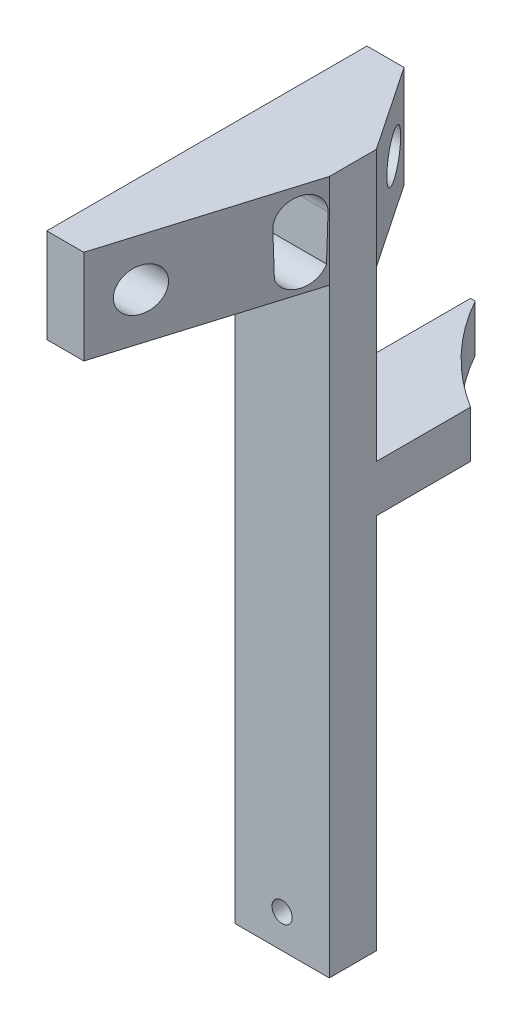
ISO-10303-21;
HEADER;
FILE_DESCRIPTION(('STEP AP214'),'2;1');
FILE_NAME('part.step','',(''),(''),'','','');
FILE_SCHEMA(('AUTOMOTIVE_DESIGN { 1 0 10303 214 1 1 1 1 }'));
ENDSEC;
DATA;
#1=APPLICATION_CONTEXT('core data for automotive mechanical design processes');
#2=APPLICATION_PROTOCOL_DEFINITION('international standard','automotive_design',2000,#1);
#3=PRODUCT_CONTEXT('',#1,'mechanical');
#4=PRODUCT('Part','Part','',(#3));
#5=PRODUCT_RELATED_PRODUCT_CATEGORY('part','',(#4));
#6=PRODUCT_DEFINITION_FORMATION('','',#4);
#7=PRODUCT_DEFINITION_CONTEXT('part definition',#1,'design');
#8=PRODUCT_DEFINITION('design','',#6,#7);
#9=PRODUCT_DEFINITION_SHAPE('','',#8);
#10=(LENGTH_UNIT() NAMED_UNIT(*) SI_UNIT(.MILLI.,.METRE.));
#11=(NAMED_UNIT(*) PLANE_ANGLE_UNIT() SI_UNIT($,.RADIAN.));
#12=(NAMED_UNIT(*) SI_UNIT($,.STERADIAN.) SOLID_ANGLE_UNIT());
#13=UNCERTAINTY_MEASURE_WITH_UNIT(LENGTH_MEASURE(1.E-05),#10,'distance_accuracy_value','');
#14=(GEOMETRIC_REPRESENTATION_CONTEXT(3) GLOBAL_UNCERTAINTY_ASSIGNED_CONTEXT((#13)) GLOBAL_UNIT_ASSIGNED_CONTEXT((#10,
#11,#12)) REPRESENTATION_CONTEXT('',''));
#15=CARTESIAN_POINT('',(0.,0.,0.));
#16=DIRECTION('',(0.,0.,1.));
#17=DIRECTION('',(1.,0.,0.));
#18=AXIS2_PLACEMENT_3D('',#15,#16,#17);
#19=CARTESIAN_POINT('',(0.,0.,0.));
#20=DIRECTION('',(0.,0.,1.));
#21=DIRECTION('',(1.,0.,0.));
#22=AXIS2_PLACEMENT_3D('',#19,#20,#21);
#23=PLANE('',#22);
#24=CARTESIAN_POINT('',(20.,-124.653388527127,0.));
#25=DIRECTION('',(0.,0.,1.));
#26=DIRECTION('',(1.,0.,0.));
#27=AXIS2_PLACEMENT_3D('',#24,#25,#26);
#28=CIRCLE('',#27,2.15);
#29=CARTESIAN_POINT('',(22.15,-124.653388527127,0.));
#30=VERTEX_POINT('',#29);
#31=EDGE_CURVE('E285',#30,#30,#28,.T.);
#32=ORIENTED_EDGE('',*,*,#31,.T.);
#33=EDGE_LOOP('',(#32));
#34=FACE_BOUND('',#33,.T.);
#35=DIRECTION('',(-1.,0.,0.));
#36=VECTOR('',#35,1.);
#37=CARTESIAN_POINT('',(30.0137626059961,-51.8033885271269,0.));
#38=LINE('',#37,#36);
#39=CARTESIAN_POINT('',(30.0137626059961,-51.8033885271269,0.));
#40=VERTEX_POINT('',#39);
#41=CARTESIAN_POINT('',(10.0137626059961,-51.8033885271269,0.));
#42=VERTEX_POINT('',#41);
#43=EDGE_CURVE('E379',#40,#42,#38,.T.);
#44=ORIENTED_EDGE('',*,*,#43,.F.);
#45=DIRECTION('',(0.,1.,0.));
#46=VECTOR('',#45,1.);
#47=CARTESIAN_POINT('',(30.0137626059961,15.6116114728731,0.));
#48=LINE('',#47,#46);
#49=CARTESIAN_POINT('',(30.0137626059961,-131.803388527127,0.));
#50=VERTEX_POINT('',#49);
#51=EDGE_CURVE('E184',#50,#40,#48,.T.);
#52=ORIENTED_EDGE('',*,*,#51,.F.);
#53=DIRECTION('',(1.,0.,0.));
#54=VECTOR('',#53,1.);
#55=CARTESIAN_POINT('',(10.0137626059961,-131.803388527127,0.));
#56=LINE('',#55,#54);
#57=CARTESIAN_POINT('',(10.0137626059961,-131.803388527127,0.));
#58=VERTEX_POINT('',#57);
#59=EDGE_CURVE('E302',#58,#50,#56,.T.);
#60=ORIENTED_EDGE('',*,*,#59,.F.);
#61=DIRECTION('',(0.,-1.,0.));
#62=VECTOR('',#61,1.);
#63=CARTESIAN_POINT('',(10.0137626059961,15.6116114728731,0.));
#64=LINE('',#63,#62);
#65=EDGE_CURVE('E289',#42,#58,#64,.T.);
#66=ORIENTED_EDGE('',*,*,#65,.F.);
#67=EDGE_LOOP('',(#44,#52,#60,#66));
#68=FACE_BOUND('',#67,.T.);
#69=ADVANCED_FACE('F39',(#34,#68),#23,.F.);
#70=DIRECTION('',(1.,0.,0.));
#71=VECTOR('',#70,1.);
#72=CARTESIAN_POINT('',(30.0137626059961,-41.8033885271269,0.));
#73=LINE('',#72,#71);
#74=CARTESIAN_POINT('',(10.0137626059961,-41.8033885271269,0.));
#75=VERTEX_POINT('',#74);
#76=CARTESIAN_POINT('',(30.0137626059961,-41.8033885271269,0.));
#77=VERTEX_POINT('',#76);
#78=EDGE_CURVE('E365',#75,#77,#73,.T.);
#79=ORIENTED_EDGE('',*,*,#78,.F.);
#80=CARTESIAN_POINT('',(10.0137626059961,-6.02423430513092,0.));
#81=VERTEX_POINT('',#80);
#82=EDGE_CURVE('E299',#81,#75,#64,.T.);
#83=ORIENTED_EDGE('',*,*,#82,.F.);
#84=DIRECTION('',(-1.,0.,0.));
#85=VECTOR('',#84,1.);
#86=CARTESIAN_POINT('',(30.0137626059961,-6.02423430513092,0.));
#87=LINE('',#86,#85);
#88=CARTESIAN_POINT('',(30.0137626059961,-6.02423430513092,0.));
#89=VERTEX_POINT('',#88);
#90=EDGE_CURVE('E257',#89,#81,#87,.T.);
#91=ORIENTED_EDGE('',*,*,#90,.F.);
#92=EDGE_CURVE('E304',#77,#89,#48,.T.);
#93=ORIENTED_EDGE('',*,*,#92,.F.);
#94=EDGE_LOOP('',(#79,#83,#91,#93));
#95=FACE_BOUND('',#94,.T.);
#96=ADVANCED_FACE('F364',(#95),#23,.F.);
#97=CARTESIAN_POINT('',(30.0137626059961,15.6116114728731,10.));
#98=DIRECTION('',(-1.,0.,0.));
#99=DIRECTION('',(0.,-1.,0.));
#100=AXIS2_PLACEMENT_3D('',#97,#98,#99);
#101=PLANE('',#100);
#102=DIRECTION('',(0.,0.,1.));
#103=VECTOR('',#102,1.);
#104=CARTESIAN_POINT('',(30.0137626059961,-51.8033885271269,-40.));
#105=LINE('',#104,#103);
#106=CARTESIAN_POINT('',(30.0137626059961,-51.8033885271269,-20.));
#107=VERTEX_POINT('',#106);
#108=EDGE_CURVE('E176',#107,#40,#105,.T.);
#109=ORIENTED_EDGE('',*,*,#108,.F.);
#110=DIRECTION('',(0.,1.,0.));
#111=VECTOR('',#110,1.);
#112=CARTESIAN_POINT('',(30.0137626059961,-131.804388527127,-20.));
#113=LINE('',#112,#111);
#114=CARTESIAN_POINT('',(30.0137626059961,-41.8033885271269,-20.));
#115=VERTEX_POINT('',#114);
#116=EDGE_CURVE('E164',#107,#115,#113,.T.);
#117=ORIENTED_EDGE('',*,*,#116,.T.);
#118=DIRECTION('',(0.,0.,1.));
#119=VECTOR('',#118,1.);
#120=CARTESIAN_POINT('',(30.0137626059961,-41.8033885271269,-40.));
#121=LINE('',#120,#119);
#122=EDGE_CURVE('E360',#115,#77,#121,.T.);
#123=ORIENTED_EDGE('',*,*,#122,.T.);
#124=ORIENTED_EDGE('',*,*,#92,.T.);
#125=DIRECTION('',(0.,1.,0.));
#126=VECTOR('',#125,1.);
#127=CARTESIAN_POINT('',(30.0137626059961,-14.3883885271269,0.));
#128=LINE('',#127,#126);
#129=CARTESIAN_POINT('',(30.0137626059961,15.6116114728731,0.));
#130=VERTEX_POINT('',#129);
#131=EDGE_CURVE('E241',#89,#130,#128,.T.);
#132=ORIENTED_EDGE('',*,*,#131,.T.);
#133=DIRECTION('',(0.,0.,-1.));
#134=VECTOR('',#133,1.);
#135=CARTESIAN_POINT('',(30.0137626059961,15.6116114728731,10.));
#136=LINE('',#135,#134);
#137=CARTESIAN_POINT('',(30.0137626059961,15.6116114728731,10.));
#138=VERTEX_POINT('',#137);
#139=EDGE_CURVE('E307',#138,#130,#136,.T.);
#140=ORIENTED_EDGE('',*,*,#139,.F.);
#141=DIRECTION('',(0.,1.,0.));
#142=VECTOR('',#141,1.);
#143=CARTESIAN_POINT('',(30.0137626059961,-14.3883885271269,10.));
#144=LINE('',#143,#142);
#145=CARTESIAN_POINT('',(30.0137626059961,-4.38838852712687,10.));
#146=VERTEX_POINT('',#145);
#147=EDGE_CURVE('E245',#146,#138,#144,.T.);
#148=ORIENTED_EDGE('',*,*,#147,.F.);
#149=DIRECTION('',(0.,1.,0.));
#150=VECTOR('',#149,1.);
#151=CARTESIAN_POINT('',(30.0137626059961,15.6116114728731,10.));
#152=LINE('',#151,#150);
#153=CARTESIAN_POINT('',(30.0137626059961,-131.803388527127,10.));
#154=VERTEX_POINT('',#153);
#155=EDGE_CURVE('E296',#154,#146,#152,.T.);
#156=ORIENTED_EDGE('',*,*,#155,.F.);
#157=DIRECTION('',(0.,0.,-1.));
#158=VECTOR('',#157,1.);
#159=CARTESIAN_POINT('',(30.0137626059961,-131.803388527127,10.));
#160=LINE('',#159,#158);
#161=EDGE_CURVE('E310',#154,#50,#160,.T.);
#162=ORIENTED_EDGE('',*,*,#161,.T.);
#163=ORIENTED_EDGE('',*,*,#51,.T.);
#164=EDGE_LOOP('',(#109,#117,#123,#124,#132,#140,#148,#156,#162,#163));
#165=FACE_BOUND('',#164,.T.);
#166=ADVANCED_FACE('F181',(#165),#101,.F.);
#167=CARTESIAN_POINT('',(10.0137626059961,15.6116114728731,10.));
#168=DIRECTION('',(0.,-1.,0.));
#169=DIRECTION('',(0.,0.,-1.));
#170=AXIS2_PLACEMENT_3D('',#167,#168,#169);
#171=PLANE('',#170);
#172=DIRECTION('',(0.289980833294845,0.,-0.957032453118298));
#173=VECTOR('',#172,1.);
#174=CARTESIAN_POINT('',(30.0137626059961,15.6116114728731,10.));
#175=LINE('',#174,#173);
#176=CARTESIAN_POINT('',(17.8937626059961,15.6116114728731,50.));
#177=VERTEX_POINT('',#176);
#178=EDGE_CURVE('E242',#177,#138,#175,.T.);
#179=ORIENTED_EDGE('',*,*,#178,.T.);
#180=ORIENTED_EDGE('',*,*,#139,.T.);
#181=DIRECTION('',(-0.558522736207715,0.,-0.829489212189675));
#182=VECTOR('',#181,1.);
#183=CARTESIAN_POINT('',(30.0137626059961,15.6116114728731,0.));
#184=LINE('',#183,#182);
#185=CARTESIAN_POINT('',(17.8937626059961,15.6116114728731,-18.));
#186=VERTEX_POINT('',#185);
#187=EDGE_CURVE('E246',#130,#186,#184,.T.);
#188=ORIENTED_EDGE('',*,*,#187,.T.);
#189=DIRECTION('',(1.,0.,0.));
#190=VECTOR('',#189,1.);
#191=CARTESIAN_POINT('',(30.0137626059961,15.6116114728731,-18.));
#192=LINE('',#191,#190);
#193=CARTESIAN_POINT('',(10.0137626059961,15.6116114728731,-18.));
#194=VERTEX_POINT('',#193);
#195=EDGE_CURVE('E263',#194,#186,#192,.T.);
#196=ORIENTED_EDGE('',*,*,#195,.F.);
#197=DIRECTION('',(0.,0.,-1.));
#198=VECTOR('',#197,1.);
#199=CARTESIAN_POINT('',(10.0137626059961,15.6116114728731,10.));
#200=LINE('',#199,#198);
#201=CARTESIAN_POINT('',(10.0137626059961,15.6116114728731,50.));
#202=VERTEX_POINT('',#201);
#203=EDGE_CURVE('E298',#202,#194,#200,.T.);
#204=ORIENTED_EDGE('',*,*,#203,.F.);
#205=DIRECTION('',(-1.,0.,0.));
#206=VECTOR('',#205,1.);
#207=CARTESIAN_POINT('',(10.0137626059961,15.6116114728731,50.));
#208=LINE('',#207,#206);
#209=EDGE_CURVE('E278',#177,#202,#208,.T.);
#210=ORIENTED_EDGE('',*,*,#209,.F.);
#211=EDGE_LOOP('',(#179,#180,#188,#196,#204,#210));
#212=FACE_BOUND('',#211,.T.);
#213=ADVANCED_FACE('F355',(#212),#171,.F.);
#214=CARTESIAN_POINT('',(10.0137626059961,-4.38838852712687,50.));
#215=DIRECTION('',(0.,1.,0.));
#216=DIRECTION('',(0.,0.,1.));
#217=AXIS2_PLACEMENT_3D('',#214,#215,#216);
#218=PLANE('',#217);
#219=DIRECTION('',(0.289980833294845,0.,-0.957032453118298));
#220=VECTOR('',#219,1.);
#221=CARTESIAN_POINT('',(17.2311422026105,-4.38838852712687,52.1868660177742));
#222=LINE('',#221,#220);
#223=CARTESIAN_POINT('',(17.8937626059961,-4.38838852712687,50.));
#224=VERTEX_POINT('',#223);
#225=EDGE_CURVE('E254',#224,#146,#222,.T.);
#226=ORIENTED_EDGE('',*,*,#225,.F.);
#227=DIRECTION('',(1.,0.,0.));
#228=VECTOR('',#227,1.);
#229=CARTESIAN_POINT('',(10.0137626059961,-4.38838852712687,50.));
#230=LINE('',#229,#228);
#231=CARTESIAN_POINT('',(10.0137626059961,-4.38838852712687,50.));
#232=VERTEX_POINT('',#231);
#233=EDGE_CURVE('E275',#232,#224,#230,.T.);
#234=ORIENTED_EDGE('',*,*,#233,.F.);
#235=DIRECTION('',(0.,0.,-1.));
#236=VECTOR('',#235,1.);
#237=CARTESIAN_POINT('',(10.0137626059961,-4.38838852712687,50.));
#238=LINE('',#237,#236);
#239=CARTESIAN_POINT('',(10.0137626059961,-4.38838852712687,10.));
#240=VERTEX_POINT('',#239);
#241=EDGE_CURVE('E280',#232,#240,#238,.T.);
#242=ORIENTED_EDGE('',*,*,#241,.T.);
#243=DIRECTION('',(1.,0.,0.));
#244=VECTOR('',#243,1.);
#245=CARTESIAN_POINT('',(10.0137626059961,-4.38838852712687,10.));
#246=LINE('',#245,#244);
#247=EDGE_CURVE('E271',#240,#146,#246,.T.);
#248=ORIENTED_EDGE('',*,*,#247,.T.);
#249=EDGE_LOOP('',(#226,#234,#242,#248));
#250=FACE_BOUND('',#249,.T.);
#251=ADVANCED_FACE('F406',(#250),#218,.F.);
#252=CARTESIAN_POINT('',(0.,0.,50.));
#253=DIRECTION('',(0.,0.,1.));
#254=DIRECTION('',(1.,0.,0.));
#255=AXIS2_PLACEMENT_3D('',#252,#253,#254);
#256=PLANE('',#255);
#257=ORIENTED_EDGE('',*,*,#233,.T.);
#258=DIRECTION('',(0.,1.,0.));
#259=VECTOR('',#258,1.);
#260=CARTESIAN_POINT('',(17.8937626059961,0.,50.));
#261=LINE('',#260,#259);
#262=EDGE_CURVE('E318',#224,#177,#261,.T.);
#263=ORIENTED_EDGE('',*,*,#262,.T.);
#264=ORIENTED_EDGE('',*,*,#209,.T.);
#265=DIRECTION('',(0.,-1.,0.));
#266=VECTOR('',#265,1.);
#267=CARTESIAN_POINT('',(10.0137626059961,15.6116114728731,50.));
#268=LINE('',#267,#266);
#269=EDGE_CURVE('E272',#202,#232,#268,.T.);
#270=ORIENTED_EDGE('',*,*,#269,.T.);
#271=EDGE_LOOP('',(#257,#263,#264,#270));
#272=FACE_BOUND('',#271,.T.);
#273=ADVANCED_FACE('F429',(#272),#256,.T.);
#274=CARTESIAN_POINT('',(30.0137626059961,-6.02423430513092,-18.));
#275=DIRECTION('',(0.,1.,0.));
#276=DIRECTION('',(0.,0.,1.));
#277=AXIS2_PLACEMENT_3D('',#274,#275,#276);
#278=PLANE('',#277);
#279=DIRECTION('',(-0.558522736207715,0.,-0.829489212189675));
#280=VECTOR('',#279,1.);
#281=CARTESIAN_POINT('',(21.6745680859508,-6.02423430513092,-12.3849423565028));
#282=LINE('',#281,#280);
#283=CARTESIAN_POINT('',(17.893762605996,-6.02423430513092,-18.));
#284=VERTEX_POINT('',#283);
#285=EDGE_CURVE('E248',#89,#284,#282,.T.);
#286=ORIENTED_EDGE('',*,*,#285,.F.);
#287=ORIENTED_EDGE('',*,*,#90,.T.);
#288=DIRECTION('',(0.,0.,1.));
#289=VECTOR('',#288,1.);
#290=CARTESIAN_POINT('',(10.0137626059961,-6.02423430513092,-18.));
#291=LINE('',#290,#289);
#292=CARTESIAN_POINT('',(10.0137626059961,-6.02423430513092,-18.));
#293=VERTEX_POINT('',#292);
#294=EDGE_CURVE('E266',#293,#81,#291,.T.);
#295=ORIENTED_EDGE('',*,*,#294,.F.);
#296=DIRECTION('',(-1.,0.,0.));
#297=VECTOR('',#296,1.);
#298=CARTESIAN_POINT('',(30.0137626059961,-6.02423430513092,-18.));
#299=LINE('',#298,#297);
#300=EDGE_CURVE('E258',#284,#293,#299,.T.);
#301=ORIENTED_EDGE('',*,*,#300,.F.);
#302=EDGE_LOOP('',(#286,#287,#295,#301));
#303=FACE_BOUND('',#302,.T.);
#304=ADVANCED_FACE('F350',(#303),#278,.F.);
#305=CARTESIAN_POINT('',(0.,0.,-18.));
#306=DIRECTION('',(0.,0.,-1.));
#307=DIRECTION('',(-1.,0.,0.));
#308=AXIS2_PLACEMENT_3D('',#305,#306,#307);
#309=PLANE('',#308);
#310=ORIENTED_EDGE('',*,*,#195,.T.);
#311=DIRECTION('',(0.,-1.,0.));
#312=VECTOR('',#311,1.);
#313=CARTESIAN_POINT('',(17.893762605996,0.,-18.));
#314=LINE('',#313,#312);
#315=EDGE_CURVE('E315',#186,#284,#314,.T.);
#316=ORIENTED_EDGE('',*,*,#315,.T.);
#317=ORIENTED_EDGE('',*,*,#300,.T.);
#318=DIRECTION('',(0.,1.,0.));
#319=VECTOR('',#318,1.);
#320=CARTESIAN_POINT('',(10.0137626059961,15.6116114728731,-18.));
#321=LINE('',#320,#319);
#322=EDGE_CURVE('E260',#293,#194,#321,.T.);
#323=ORIENTED_EDGE('',*,*,#322,.T.);
#324=EDGE_LOOP('',(#310,#316,#317,#323));
#325=FACE_BOUND('',#324,.T.);
#326=ADVANCED_FACE('F347',(#325),#309,.T.);
#327=CARTESIAN_POINT('',(0.,0.,10.));
#328=DIRECTION('',(0.,0.,1.));
#329=DIRECTION('',(1.,0.,0.));
#330=AXIS2_PLACEMENT_3D('',#327,#328,#329);
#331=PLANE('',#330);
#332=ORIENTED_EDGE('',*,*,#247,.F.);
#333=DIRECTION('',(0.,-1.,0.));
#334=VECTOR('',#333,1.);
#335=CARTESIAN_POINT('',(10.0137626059961,15.6116114728731,10.));
#336=LINE('',#335,#334);
#337=CARTESIAN_POINT('',(10.0137626059961,-131.803388527127,10.));
#338=VERTEX_POINT('',#337);
#339=EDGE_CURVE('E292',#240,#338,#336,.T.);
#340=ORIENTED_EDGE('',*,*,#339,.T.);
#341=DIRECTION('',(1.,0.,0.));
#342=VECTOR('',#341,1.);
#343=CARTESIAN_POINT('',(10.0137626059961,-131.803388527127,10.));
#344=LINE('',#343,#342);
#345=EDGE_CURVE('E294',#338,#154,#344,.T.);
#346=ORIENTED_EDGE('',*,*,#345,.T.);
#347=ORIENTED_EDGE('',*,*,#155,.T.);
#348=EDGE_LOOP('',(#332,#340,#346,#347));
#349=FACE_BOUND('',#348,.T.);
#350=CARTESIAN_POINT('',(20.,-124.653388527127,10.));
#351=DIRECTION('',(0.,0.,1.));
#352=DIRECTION('',(1.,0.,0.));
#353=AXIS2_PLACEMENT_3D('',#350,#351,#352);
#354=CIRCLE('',#353,2.15);
#355=CARTESIAN_POINT('',(22.15,-124.653388527127,10.));
#356=VERTEX_POINT('',#355);
#357=EDGE_CURVE('E286',#356,#356,#354,.T.);
#358=ORIENTED_EDGE('',*,*,#357,.F.);
#359=EDGE_LOOP('',(#358));
#360=FACE_BOUND('',#359,.T.);
#361=ADVANCED_FACE('F402',(#349,#360),#331,.T.);
#362=CARTESIAN_POINT('',(10.0137626059961,15.6116114728731,10.));
#363=DIRECTION('',(1.,0.,0.));
#364=DIRECTION('',(0.,1.,0.));
#365=AXIS2_PLACEMENT_3D('',#362,#363,#364);
#366=PLANE('',#365);
#367=CARTESIAN_POINT('',(10.0137626059961,5.49974848952432,40.7));
#368=DIRECTION('',(-1.,0.,0.));
#369=DIRECTION('',(0.,-1.,0.));
#370=AXIS2_PLACEMENT_3D('',#367,#368,#369);
#371=CIRCLE('',#370,2.15);
#372=CARTESIAN_POINT('',(10.0137626059961,3.34974848952432,40.7));
#373=VERTEX_POINT('',#372);
#374=EDGE_CURVE('E229',#373,#373,#371,.T.);
#375=ORIENTED_EDGE('',*,*,#374,.F.);
#376=EDGE_LOOP('',(#375));
#377=FACE_BOUND('',#376,.T.);
#378=CARTESIAN_POINT('',(10.0137626059961,4.87427804499336,-11.3));
#379=DIRECTION('',(-1.,0.,0.));
#380=DIRECTION('',(0.,-1.,0.));
#381=AXIS2_PLACEMENT_3D('',#378,#379,#380);
#382=CIRCLE('',#381,2.15);
#383=CARTESIAN_POINT('',(10.0137626059961,2.72427804499336,-11.3));
#384=VERTEX_POINT('',#383);
#385=EDGE_CURVE('E221',#384,#384,#382,.T.);
#386=ORIENTED_EDGE('',*,*,#385,.F.);
#387=EDGE_LOOP('',(#386));
#388=FACE_BOUND('',#387,.T.);
#389=CARTESIAN_POINT('',(10.0137626059961,1.1873026157262,14.7));
#390=DIRECTION('',(-1.,0.,0.));
#391=DIRECTION('',(0.,-1.,0.));
#392=AXIS2_PLACEMENT_3D('',#389,#390,#391);
#393=CIRCLE('',#392,2.15);
#394=CARTESIAN_POINT('',(10.0137626059961,-0.962697384273796,14.7));
#395=VERTEX_POINT('',#394);
#396=EDGE_CURVE('E217',#395,#395,#393,.T.);
#397=ORIENTED_EDGE('',*,*,#396,.F.);
#398=EDGE_LOOP('',(#397));
#399=FACE_BOUND('',#398,.T.);
#400=CARTESIAN_POINT('',(10.0137626059961,9.1873026157262,14.7));
#401=DIRECTION('',(-1.,0.,0.));
#402=DIRECTION('',(0.,-1.,0.));
#403=AXIS2_PLACEMENT_3D('',#400,#401,#402);
#404=CIRCLE('',#403,2.15);
#405=CARTESIAN_POINT('',(10.0137626059961,7.0373026157262,14.7));
#406=VERTEX_POINT('',#405);
#407=EDGE_CURVE('E220',#406,#406,#404,.T.);
#408=ORIENTED_EDGE('',*,*,#407,.F.);
#409=EDGE_LOOP('',(#408));
#410=FACE_BOUND('',#409,.T.);
#411=ORIENTED_EDGE('',*,*,#203,.T.);
#412=ORIENTED_EDGE('',*,*,#322,.F.);
#413=ORIENTED_EDGE('',*,*,#294,.T.);
#414=ORIENTED_EDGE('',*,*,#82,.T.);
#415=DIRECTION('',(0.,0.,1.));
#416=VECTOR('',#415,1.);
#417=CARTESIAN_POINT('',(10.0137626059961,-41.8033885271269,-40.));
#418=LINE('',#417,#416);
#419=CARTESIAN_POINT('',(10.0137626059961,-41.8033885271269,-40.));
#420=VERTEX_POINT('',#419);
#421=EDGE_CURVE('E189',#420,#75,#418,.T.);
#422=ORIENTED_EDGE('',*,*,#421,.F.);
#423=DIRECTION('',(0.,1.,0.));
#424=VECTOR('',#423,1.);
#425=CARTESIAN_POINT('',(10.0137626059961,-41.8033885271269,-40.));
#426=LINE('',#425,#424);
#427=CARTESIAN_POINT('',(10.0137626059961,-51.8033885271269,-40.));
#428=VERTEX_POINT('',#427);
#429=EDGE_CURVE('E368',#428,#420,#426,.T.);
#430=ORIENTED_EDGE('',*,*,#429,.F.);
#431=DIRECTION('',(0.,0.,1.));
#432=VECTOR('',#431,1.);
#433=CARTESIAN_POINT('',(10.0137626059961,-51.8033885271269,-40.));
#434=LINE('',#433,#432);
#435=EDGE_CURVE('E64',#428,#42,#434,.T.);
#436=ORIENTED_EDGE('',*,*,#435,.T.);
#437=ORIENTED_EDGE('',*,*,#65,.T.);
#438=DIRECTION('',(0.,0.,-1.));
#439=VECTOR('',#438,1.);
#440=CARTESIAN_POINT('',(10.0137626059961,-131.803388527127,10.));
#441=LINE('',#440,#439);
#442=EDGE_CURVE('E312',#338,#58,#441,.T.);
#443=ORIENTED_EDGE('',*,*,#442,.F.);
#444=ORIENTED_EDGE('',*,*,#339,.F.);
#445=ORIENTED_EDGE('',*,*,#241,.F.);
#446=ORIENTED_EDGE('',*,*,#269,.F.);
#447=EDGE_LOOP('',(#411,#412,#413,#414,#422,#430,#436,#437,#443,#444,#445,#446));
#448=FACE_BOUND('',#447,.T.);
#449=ADVANCED_FACE('F41',(#377,#388,#399,#410,#448),#366,.F.);
#450=CARTESIAN_POINT('',(10.0137626059961,-131.803388527127,10.));
#451=DIRECTION('',(0.,1.,0.));
#452=DIRECTION('',(0.,0.,1.));
#453=AXIS2_PLACEMENT_3D('',#450,#451,#452);
#454=PLANE('',#453);
#455=ORIENTED_EDGE('',*,*,#59,.T.);
#456=ORIENTED_EDGE('',*,*,#161,.F.);
#457=ORIENTED_EDGE('',*,*,#345,.F.);
#458=ORIENTED_EDGE('',*,*,#442,.T.);
#459=EDGE_LOOP('',(#455,#456,#457,#458));
#460=FACE_BOUND('',#459,.T.);
#461=ADVANCED_FACE('F408',(#460),#454,.F.);
#462=CARTESIAN_POINT('',(20.,-124.653388527127,10.));
#463=DIRECTION('',(0.,0.,-1.));
#464=DIRECTION('',(-1.,0.,0.));
#465=AXIS2_PLACEMENT_3D('',#462,#463,#464);
#466=CYLINDRICAL_SURFACE('',#465,2.15);
#467=ORIENTED_EDGE('',*,*,#357,.T.);
#468=EDGE_LOOP('',(#467));
#469=FACE_BOUND('',#468,.T.);
#470=ORIENTED_EDGE('',*,*,#31,.F.);
#471=EDGE_LOOP('',(#470));
#472=FACE_BOUND('',#471,.T.);
#473=ADVANCED_FACE('F339',(#469,#472),#466,.F.);
#474=CARTESIAN_POINT('',(30.0137626059961,-14.3883885271269,0.));
#475=DIRECTION('',(0.829489212189675,0.,-0.558522736207715));
#476=DIRECTION('',(-0.558522736207715,0.,-0.829489212189675));
#477=AXIS2_PLACEMENT_3D('',#474,#475,#476);
#478=PLANE('',#477);
#479=CARTESIAN_POINT('',(22.4050959393294,4.87427804499336,-11.3));
#480=DIRECTION('',(0.829489212189675,0.,-0.558522736207715));
#481=DIRECTION('',(-0.558522736207715,0.,-0.829489212189675));
#482=AXIS2_PLACEMENT_3D('',#479,#480,#481);
#483=ELLIPSE('',#482,5.42502534556291,4.5);
#484=CARTESIAN_POINT('',(19.3750959393294,4.87427804499336,-15.8));
#485=VERTEX_POINT('',#484);
#486=EDGE_CURVE('E43',#485,#485,#483,.T.);
#487=ORIENTED_EDGE('',*,*,#486,.F.);
#488=EDGE_LOOP('',(#487));
#489=FACE_BOUND('',#488,.T.);
#490=ORIENTED_EDGE('',*,*,#285,.T.);
#491=ORIENTED_EDGE('',*,*,#315,.F.);
#492=ORIENTED_EDGE('',*,*,#187,.F.);
#493=ORIENTED_EDGE('',*,*,#131,.F.);
#494=EDGE_LOOP('',(#490,#491,#492,#493));
#495=FACE_BOUND('',#494,.T.);
#496=ADVANCED_FACE('F335',(#489,#495),#478,.T.);
#497=CARTESIAN_POINT('',(30.0137626059961,-14.3883885271269,10.));
#498=DIRECTION('',(0.957032453118298,0.,0.289980833294845));
#499=DIRECTION('',(0.289980833294845,0.,-0.957032453118298));
#500=AXIS2_PLACEMENT_3D('',#497,#498,#499);
#501=PLANE('',#500);
#502=CARTESIAN_POINT('',(20.7116626059961,5.49974848952432,40.7));
#503=DIRECTION('',(0.957032453118298,0.,0.289980833294845));
#504=DIRECTION('',(-0.289980833294845,0.,0.957032453118298));
#505=AXIS2_PLACEMENT_3D('',#502,#503,#504);
#506=ELLIPSE('',#505,4.70203490522986,4.5);
#507=CARTESIAN_POINT('',(19.3481626059961,5.49974848952432,45.2));
#508=VERTEX_POINT('',#507);
#509=EDGE_CURVE('E196',#508,#508,#506,.T.);
#510=ORIENTED_EDGE('',*,*,#509,.F.);
#511=EDGE_LOOP('',(#510));
#512=FACE_BOUND('',#511,.T.);
#513=CARTESIAN_POINT('',(28.5896626059961,9.1873026157262,14.7));
#514=DIRECTION('',(0.957032453118298,0.,0.289980833294845));
#515=DIRECTION('',(-0.289980833294845,0.,0.957032453118298));
#516=AXIS2_PLACEMENT_3D('',#513,#514,#515);
#517=ELLIPSE('',#516,4.70203490522986,4.5);
#518=CARTESIAN_POINT('',(29.9531626059961,9.1873026157262,10.2));
#519=VERTEX_POINT('',#518);
#520=CARTESIAN_POINT('',(27.2261626059961,9.1873026157262,19.2));
#521=VERTEX_POINT('',#520);
#522=EDGE_CURVE('E11',#519,#521,#517,.T.);
#523=ORIENTED_EDGE('',*,*,#522,.F.);
#524=DIRECTION('',(0.00821574759390685,0.999598567275789,-0.0271146785277454));
#525=VECTOR('',#524,1.);
#526=CARTESIAN_POINT('',(29.7595970763733,-14.3635457852637,10.8388301307682));
#527=LINE('',#526,#525);
#528=CARTESIAN_POINT('',(29.8750732639733,-0.313718869320733,10.4577206007351));
#529=VERTEX_POINT('',#528);
#530=EDGE_CURVE('E321',#529,#519,#527,.T.);
#531=ORIENTED_EDGE('',*,*,#530,.F.);
#532=CARTESIAN_POINT('',(28.5896626059961,1.1873026157262,14.7));
#533=DIRECTION('',(0.957032453118298,0.,0.289980833294845));
#534=DIRECTION('',(-0.289980833294845,0.,0.957032453118298));
#535=AXIS2_PLACEMENT_3D('',#532,#533,#534);
#536=ELLIPSE('',#535,4.70203490522986,4.5);
#537=CARTESIAN_POINT('',(27.3042519480188,-0.313718869320731,18.9422793992649));
#538=VERTEX_POINT('',#537);
#539=EDGE_CURVE('E323',#538,#529,#536,.T.);
#540=ORIENTED_EDGE('',*,*,#539,.F.);
#541=DIRECTION('',(0.00821574759390658,-0.999598567275789,-0.0271146785277445));
#542=VECTOR('',#541,1.);
#543=CARTESIAN_POINT('',(27.4220143980066,-14.6417121457976,18.55362444881));
#544=LINE('',#543,#542);
#545=EDGE_CURVE('E48',#521,#538,#544,.T.);
#546=ORIENTED_EDGE('',*,*,#545,.F.);
#547=EDGE_LOOP('',(#523,#531,#540,#546));
#548=FACE_BOUND('',#547,.T.);
#549=ORIENTED_EDGE('',*,*,#225,.T.);
#550=ORIENTED_EDGE('',*,*,#147,.T.);
#551=ORIENTED_EDGE('',*,*,#178,.F.);
#552=ORIENTED_EDGE('',*,*,#262,.F.);
#553=EDGE_LOOP('',(#549,#550,#551,#552));
#554=FACE_BOUND('',#553,.T.);
#555=ADVANCED_FACE('F338',(#512,#548,#554),#501,.T.);
#556=CARTESIAN_POINT('',(12.0137626059961,9.1873026157262,14.7));
#557=DIRECTION('',(-1.,0.,0.));
#558=DIRECTION('',(0.,-1.,0.));
#559=AXIS2_PLACEMENT_3D('',#556,#557,#558);
#560=CYLINDRICAL_SURFACE('',#559,2.15);
#561=CARTESIAN_POINT('',(12.0137626059961,9.1873026157262,14.7));
#562=DIRECTION('',(-1.,0.,0.));
#563=DIRECTION('',(0.,-1.,0.));
#564=AXIS2_PLACEMENT_3D('',#561,#562,#563);
#565=CIRCLE('',#564,2.15);
#566=CARTESIAN_POINT('',(12.0137626059961,7.0373026157262,14.7));
#567=VERTEX_POINT('',#566);
#568=EDGE_CURVE('E225',#567,#567,#565,.T.);
#569=ORIENTED_EDGE('',*,*,#568,.F.);
#570=EDGE_LOOP('',(#569));
#571=FACE_BOUND('',#570,.T.);
#572=ORIENTED_EDGE('',*,*,#407,.T.);
#573=EDGE_LOOP('',(#572));
#574=FACE_BOUND('',#573,.T.);
#575=ADVANCED_FACE('F432',(#571,#574),#560,.F.);
#576=CARTESIAN_POINT('',(12.0137626059961,1.1873026157262,14.7));
#577=DIRECTION('',(-1.,0.,0.));
#578=DIRECTION('',(0.,-1.,0.));
#579=AXIS2_PLACEMENT_3D('',#576,#577,#578);
#580=CYLINDRICAL_SURFACE('',#579,2.15);
#581=CARTESIAN_POINT('',(12.0137626059961,1.1873026157262,14.7));
#582=DIRECTION('',(-1.,0.,0.));
#583=DIRECTION('',(0.,-1.,0.));
#584=AXIS2_PLACEMENT_3D('',#581,#582,#583);
#585=CIRCLE('',#584,2.15);
#586=CARTESIAN_POINT('',(12.0137626059961,-0.962697384273796,14.7));
#587=VERTEX_POINT('',#586);
#588=EDGE_CURVE('E222',#587,#587,#585,.T.);
#589=ORIENTED_EDGE('',*,*,#588,.F.);
#590=EDGE_LOOP('',(#589));
#591=FACE_BOUND('',#590,.T.);
#592=ORIENTED_EDGE('',*,*,#396,.T.);
#593=EDGE_LOOP('',(#592));
#594=FACE_BOUND('',#593,.T.);
#595=ADVANCED_FACE('F439',(#591,#594),#580,.F.);
#596=CARTESIAN_POINT('',(12.0137626059961,4.87427804499336,-11.3));
#597=DIRECTION('',(-1.,0.,0.));
#598=DIRECTION('',(0.,-1.,0.));
#599=AXIS2_PLACEMENT_3D('',#596,#597,#598);
#600=CYLINDRICAL_SURFACE('',#599,2.15);
#601=CARTESIAN_POINT('',(12.0137626059961,4.87427804499336,-11.3));
#602=DIRECTION('',(-1.,0.,0.));
#603=DIRECTION('',(0.,-1.,0.));
#604=AXIS2_PLACEMENT_3D('',#601,#602,#603);
#605=CIRCLE('',#604,2.15);
#606=CARTESIAN_POINT('',(12.0137626059961,2.72427804499336,-11.3));
#607=VERTEX_POINT('',#606);
#608=EDGE_CURVE('E226',#607,#607,#605,.T.);
#609=ORIENTED_EDGE('',*,*,#608,.F.);
#610=EDGE_LOOP('',(#609));
#611=FACE_BOUND('',#610,.T.);
#612=ORIENTED_EDGE('',*,*,#385,.T.);
#613=EDGE_LOOP('',(#612));
#614=FACE_BOUND('',#613,.T.);
#615=ADVANCED_FACE('F488',(#611,#614),#600,.F.);
#616=CARTESIAN_POINT('',(12.0137626059961,5.49974848952432,40.7));
#617=DIRECTION('',(-1.,0.,0.));
#618=DIRECTION('',(0.,-1.,0.));
#619=AXIS2_PLACEMENT_3D('',#616,#617,#618);
#620=CYLINDRICAL_SURFACE('',#619,2.15);
#621=CARTESIAN_POINT('',(12.0137626059961,5.49974848952432,40.7));
#622=DIRECTION('',(-1.,0.,0.));
#623=DIRECTION('',(0.,-1.,0.));
#624=AXIS2_PLACEMENT_3D('',#621,#622,#623);
#625=CIRCLE('',#624,2.15);
#626=CARTESIAN_POINT('',(12.0137626059961,3.34974848952432,40.7));
#627=VERTEX_POINT('',#626);
#628=EDGE_CURVE('E232',#627,#627,#625,.T.);
#629=ORIENTED_EDGE('',*,*,#628,.F.);
#630=EDGE_LOOP('',(#629));
#631=FACE_BOUND('',#630,.T.);
#632=ORIENTED_EDGE('',*,*,#374,.T.);
#633=EDGE_LOOP('',(#632));
#634=FACE_BOUND('',#633,.T.);
#635=ADVANCED_FACE('F497',(#631,#634),#620,.F.);
#636=CARTESIAN_POINT('',(32.013762605996,9.1873026157262,14.7));
#637=DIRECTION('',(-1.,0.,0.));
#638=DIRECTION('',(0.,-1.,0.));
#639=AXIS2_PLACEMENT_3D('',#636,#637,#638);
#640=CYLINDRICAL_SURFACE('',#639,4.5);
#641=ORIENTED_EDGE('',*,*,#522,.T.);
#642=DIRECTION('',(-1.,0.,0.));
#643=VECTOR('',#642,1.);
#644=CARTESIAN_POINT('',(32.013762605996,9.1873026157262,19.2));
#645=LINE('',#644,#643);
#646=CARTESIAN_POINT('',(12.0137626059961,9.1873026157262,19.2));
#647=VERTEX_POINT('',#646);
#648=EDGE_CURVE('E185',#521,#647,#645,.T.);
#649=ORIENTED_EDGE('',*,*,#648,.T.);
#650=CARTESIAN_POINT('',(12.0137626059961,9.1873026157262,14.7));
#651=DIRECTION('',(-1.,0.,0.));
#652=DIRECTION('',(0.,-1.,0.));
#653=AXIS2_PLACEMENT_3D('',#650,#651,#652);
#654=CIRCLE('',#653,4.5);
#655=CARTESIAN_POINT('',(12.0137626059961,9.1873026157262,10.2));
#656=VERTEX_POINT('',#655);
#657=EDGE_CURVE('E200',#647,#656,#654,.T.);
#658=ORIENTED_EDGE('',*,*,#657,.T.);
#659=DIRECTION('',(-1.,0.,0.));
#660=VECTOR('',#659,1.);
#661=CARTESIAN_POINT('',(32.013762605996,9.1873026157262,10.2));
#662=LINE('',#661,#660);
#663=EDGE_CURVE('E201',#519,#656,#662,.T.);
#664=ORIENTED_EDGE('',*,*,#663,.F.);
#665=EDGE_LOOP('',(#641,#649,#658,#664));
#666=FACE_BOUND('',#665,.T.);
#667=ADVANCED_FACE('F505',(#666),#640,.F.);
#668=CARTESIAN_POINT('',(32.013762605996,9.1873026157262,19.2));
#669=DIRECTION('',(0.,-0.0271155936742529,0.999632304689926));
#670=DIRECTION('',(0.,-0.999632304689926,-0.0271155936742529));
#671=AXIS2_PLACEMENT_3D('',#668,#669,#670);
#672=PLANE('',#671);
#673=ORIENTED_EDGE('',*,*,#545,.T.);
#674=DIRECTION('',(-1.,0.,0.));
#675=VECTOR('',#674,1.);
#676=CARTESIAN_POINT('',(32.0137626059961,-0.313718869320731,18.9422793992649));
#677=LINE('',#676,#675);
#678=CARTESIAN_POINT('',(12.0137626059961,-0.313718869320733,18.9422793992649));
#679=VERTEX_POINT('',#678);
#680=EDGE_CURVE('E187',#538,#679,#677,.T.);
#681=ORIENTED_EDGE('',*,*,#680,.T.);
#682=DIRECTION('',(0.,0.999632304689926,0.0271155936742529));
#683=VECTOR('',#682,1.);
#684=CARTESIAN_POINT('',(12.0137626059961,9.1873026157262,19.2));
#685=LINE('',#684,#683);
#686=EDGE_CURVE('E203',#679,#647,#685,.T.);
#687=ORIENTED_EDGE('',*,*,#686,.T.);
#688=ORIENTED_EDGE('',*,*,#648,.F.);
#689=EDGE_LOOP('',(#673,#681,#687,#688));
#690=FACE_BOUND('',#689,.T.);
#691=ADVANCED_FACE('F534',(#690),#672,.F.);
#692=CARTESIAN_POINT('',(32.0137626059961,1.1873026157262,14.7));
#693=DIRECTION('',(-1.,0.,0.));
#694=DIRECTION('',(0.,-1.,0.));
#695=AXIS2_PLACEMENT_3D('',#692,#693,#694);
#696=CYLINDRICAL_SURFACE('',#695,4.5);
#697=ORIENTED_EDGE('',*,*,#539,.T.);
#698=DIRECTION('',(-1.,0.,0.));
#699=VECTOR('',#698,1.);
#700=CARTESIAN_POINT('',(32.0137626059961,-0.31371886932073,10.4577206007351));
#701=LINE('',#700,#699);
#702=CARTESIAN_POINT('',(12.0137626059961,-0.313718869320733,10.4577206007351));
#703=VERTEX_POINT('',#702);
#704=EDGE_CURVE('E204',#529,#703,#701,.T.);
#705=ORIENTED_EDGE('',*,*,#704,.T.);
#706=CARTESIAN_POINT('',(12.0137626059961,1.1873026157262,14.7));
#707=DIRECTION('',(-1.,0.,0.));
#708=DIRECTION('',(0.,-1.,0.));
#709=AXIS2_PLACEMENT_3D('',#706,#707,#708);
#710=CIRCLE('',#709,4.5);
#711=EDGE_CURVE('E209',#703,#679,#710,.T.);
#712=ORIENTED_EDGE('',*,*,#711,.T.);
#713=ORIENTED_EDGE('',*,*,#680,.F.);
#714=EDGE_LOOP('',(#697,#705,#712,#713));
#715=FACE_BOUND('',#714,.T.);
#716=ADVANCED_FACE('F543',(#715),#696,.F.);
#717=CARTESIAN_POINT('',(32.013762605996,9.1873026157262,10.2));
#718=DIRECTION('',(0.,-0.0271155936742538,-0.999632304689926));
#719=DIRECTION('',(0.,0.999632304689926,-0.0271155936742538));
#720=AXIS2_PLACEMENT_3D('',#717,#718,#719);
#721=PLANE('',#720);
#722=ORIENTED_EDGE('',*,*,#530,.T.);
#723=ORIENTED_EDGE('',*,*,#663,.T.);
#724=DIRECTION('',(0.,-0.999632304689926,0.0271155936742538));
#725=VECTOR('',#724,1.);
#726=CARTESIAN_POINT('',(12.0137626059961,9.1873026157262,10.2));
#727=LINE('',#726,#725);
#728=EDGE_CURVE('E212',#656,#703,#727,.T.);
#729=ORIENTED_EDGE('',*,*,#728,.T.);
#730=ORIENTED_EDGE('',*,*,#704,.F.);
#731=EDGE_LOOP('',(#722,#723,#729,#730));
#732=FACE_BOUND('',#731,.T.);
#733=ADVANCED_FACE('F552',(#732),#721,.F.);
#734=CARTESIAN_POINT('',(12.0137626059961,9.1873026157262,14.7));
#735=DIRECTION('',(-1.,0.,0.));
#736=DIRECTION('',(0.,-1.,0.));
#737=AXIS2_PLACEMENT_3D('',#734,#735,#736);
#738=PLANE('',#737);
#739=ORIENTED_EDGE('',*,*,#568,.T.);
#740=EDGE_LOOP('',(#739));
#741=FACE_BOUND('',#740,.T.);
#742=ORIENTED_EDGE('',*,*,#588,.T.);
#743=EDGE_LOOP('',(#742));
#744=FACE_BOUND('',#743,.T.);
#745=ORIENTED_EDGE('',*,*,#657,.F.);
#746=ORIENTED_EDGE('',*,*,#686,.F.);
#747=ORIENTED_EDGE('',*,*,#711,.F.);
#748=ORIENTED_EDGE('',*,*,#728,.F.);
#749=EDGE_LOOP('',(#745,#746,#747,#748));
#750=FACE_BOUND('',#749,.T.);
#751=ADVANCED_FACE('F561',(#741,#744,#750),#738,.F.);
#752=CARTESIAN_POINT('',(32.0137626059961,5.49974848952432,40.7));
#753=DIRECTION('',(-1.,0.,0.));
#754=DIRECTION('',(0.,-1.,0.));
#755=AXIS2_PLACEMENT_3D('',#752,#753,#754);
#756=CYLINDRICAL_SURFACE('',#755,4.5);
#757=ORIENTED_EDGE('',*,*,#509,.T.);
#758=EDGE_LOOP('',(#757));
#759=FACE_BOUND('',#758,.T.);
#760=CARTESIAN_POINT('',(12.0137626059961,5.49974848952432,40.7));
#761=DIRECTION('',(-1.,0.,0.));
#762=DIRECTION('',(0.,-1.,0.));
#763=AXIS2_PLACEMENT_3D('',#760,#761,#762);
#764=CIRCLE('',#763,4.5);
#765=CARTESIAN_POINT('',(12.0137626059961,0.999748489524321,40.7));
#766=VERTEX_POINT('',#765);
#767=EDGE_CURVE('E193',#766,#766,#764,.T.);
#768=ORIENTED_EDGE('',*,*,#767,.T.);
#769=EDGE_LOOP('',(#768));
#770=FACE_BOUND('',#769,.T.);
#771=ADVANCED_FACE('F570',(#759,#770),#756,.F.);
#772=CARTESIAN_POINT('',(12.0137626059961,5.49974848952432,40.7));
#773=DIRECTION('',(-1.,0.,0.));
#774=DIRECTION('',(0.,-1.,0.));
#775=AXIS2_PLACEMENT_3D('',#772,#773,#774);
#776=PLANE('',#775);
#777=ORIENTED_EDGE('',*,*,#628,.T.);
#778=EDGE_LOOP('',(#777));
#779=FACE_BOUND('',#778,.T.);
#780=ORIENTED_EDGE('',*,*,#767,.F.);
#781=EDGE_LOOP('',(#780));
#782=FACE_BOUND('',#781,.T.);
#783=ADVANCED_FACE('F579',(#779,#782),#776,.F.);
#784=CARTESIAN_POINT('',(32.0137626059961,4.87427804499336,-11.3));
#785=DIRECTION('',(-1.,0.,0.));
#786=DIRECTION('',(0.,-1.,0.));
#787=AXIS2_PLACEMENT_3D('',#784,#785,#786);
#788=CYLINDRICAL_SURFACE('',#787,4.5);
#789=ORIENTED_EDGE('',*,*,#486,.T.);
#790=EDGE_LOOP('',(#789));
#791=FACE_BOUND('',#790,.T.);
#792=CARTESIAN_POINT('',(12.0137626059961,4.87427804499336,-11.3));
#793=DIRECTION('',(-1.,0.,0.));
#794=DIRECTION('',(0.,-1.,0.));
#795=AXIS2_PLACEMENT_3D('',#792,#793,#794);
#796=CIRCLE('',#795,4.5);
#797=CARTESIAN_POINT('',(12.0137626059961,0.374278044993358,-11.3));
#798=VERTEX_POINT('',#797);
#799=EDGE_CURVE('E197',#798,#798,#796,.T.);
#800=ORIENTED_EDGE('',*,*,#799,.T.);
#801=EDGE_LOOP('',(#800));
#802=FACE_BOUND('',#801,.T.);
#803=ADVANCED_FACE('F332',(#791,#802),#788,.F.);
#804=CARTESIAN_POINT('',(12.0137626059961,4.87427804499336,-11.3));
#805=DIRECTION('',(-1.,0.,0.));
#806=DIRECTION('',(0.,-1.,0.));
#807=AXIS2_PLACEMENT_3D('',#804,#805,#806);
#808=PLANE('',#807);
#809=ORIENTED_EDGE('',*,*,#608,.T.);
#810=EDGE_LOOP('',(#809));
#811=FACE_BOUND('',#810,.T.);
#812=ORIENTED_EDGE('',*,*,#799,.F.);
#813=EDGE_LOOP('',(#812));
#814=FACE_BOUND('',#813,.T.);
#815=ADVANCED_FACE('F595',(#811,#814),#808,.F.);
#816=CARTESIAN_POINT('',(30.0137626059961,-51.8033885271269,-40.));
#817=DIRECTION('',(0.,1.,0.));
#818=DIRECTION('',(0.,0.,1.));
#819=AXIS2_PLACEMENT_3D('',#816,#817,#818);
#820=PLANE('',#819);
#821=DIRECTION('',(-1.,0.,0.));
#822=VECTOR('',#821,1.);
#823=CARTESIAN_POINT('',(30.0137626059961,-51.8033885271269,-40.));
#824=LINE('',#823,#822);
#825=CARTESIAN_POINT('',(11.0137626059961,-51.8033885271269,-40.));
#826=VERTEX_POINT('',#825);
#827=EDGE_CURVE('E178',#826,#428,#824,.T.);
#828=ORIENTED_EDGE('',*,*,#827,.F.);
#829=CARTESIAN_POINT('',(59.1144509496573,-51.8033885271269,-66.6706539264782));
#830=DIRECTION('',(0.,1.,0.));
#831=DIRECTION('',(0.,0.,1.));
#832=AXIS2_PLACEMENT_3D('',#829,#830,#831);
#833=CIRCLE('',#832,55.);
#834=EDGE_CURVE('E56',#107,#826,#833,.F.);
#835=ORIENTED_EDGE('',*,*,#834,.F.);
#836=ORIENTED_EDGE('',*,*,#108,.T.);
#837=ORIENTED_EDGE('',*,*,#43,.T.);
#838=ORIENTED_EDGE('',*,*,#435,.F.);
#839=EDGE_LOOP('',(#828,#835,#836,#837,#838));
#840=FACE_BOUND('',#839,.T.);
#841=ADVANCED_FACE('F175',(#840),#820,.F.);
#842=CARTESIAN_POINT('',(30.0137626059961,-41.8033885271269,-40.));
#843=DIRECTION('',(0.,-1.,0.));
#844=DIRECTION('',(0.,0.,-1.));
#845=AXIS2_PLACEMENT_3D('',#842,#843,#844);
#846=PLANE('',#845);
#847=ORIENTED_EDGE('',*,*,#122,.F.);
#848=CARTESIAN_POINT('',(59.1144509496573,-41.8033885271269,-66.6706539264782));
#849=DIRECTION('',(0.,1.,0.));
#850=DIRECTION('',(0.,0.,1.));
#851=AXIS2_PLACEMENT_3D('',#848,#849,#850);
#852=CIRCLE('',#851,55.);
#853=CARTESIAN_POINT('',(11.0137626059961,-41.8033885271269,-40.));
#854=VERTEX_POINT('',#853);
#855=EDGE_CURVE('E167',#854,#115,#852,.T.);
#856=ORIENTED_EDGE('',*,*,#855,.F.);
#857=DIRECTION('',(1.,0.,0.));
#858=VECTOR('',#857,1.);
#859=CARTESIAN_POINT('',(30.0137626059961,-41.8033885271269,-40.));
#860=LINE('',#859,#858);
#861=EDGE_CURVE('E371',#420,#854,#860,.T.);
#862=ORIENTED_EDGE('',*,*,#861,.F.);
#863=ORIENTED_EDGE('',*,*,#421,.T.);
#864=ORIENTED_EDGE('',*,*,#78,.T.);
#865=EDGE_LOOP('',(#847,#856,#862,#863,#864));
#866=FACE_BOUND('',#865,.T.);
#867=ADVANCED_FACE('F372',(#866),#846,.F.);
#868=CARTESIAN_POINT('',(0.,0.,-40.));
#869=DIRECTION('',(0.,0.,-1.));
#870=DIRECTION('',(-1.,0.,0.));
#871=AXIS2_PLACEMENT_3D('',#868,#869,#870);
#872=PLANE('',#871);
#873=DIRECTION('',(0.,1.,0.));
#874=VECTOR('',#873,1.);
#875=CARTESIAN_POINT('',(11.0137626059961,-131.804388527127,-40.));
#876=LINE('',#875,#874);
#877=EDGE_CURVE('E171',#826,#854,#876,.T.);
#878=ORIENTED_EDGE('',*,*,#877,.F.);
#879=ORIENTED_EDGE('',*,*,#827,.T.);
#880=ORIENTED_EDGE('',*,*,#429,.T.);
#881=ORIENTED_EDGE('',*,*,#861,.T.);
#882=EDGE_LOOP('',(#878,#879,#880,#881));
#883=FACE_BOUND('',#882,.T.);
#884=ADVANCED_FACE('F383',(#883),#872,.T.);
#885=CARTESIAN_POINT('',(59.1144509496573,-131.804388527127,-66.6706539264782));
#886=DIRECTION('',(0.,1.,0.));
#887=DIRECTION('',(0.,0.,1.));
#888=AXIS2_PLACEMENT_3D('',#885,#886,#887);
#889=CYLINDRICAL_SURFACE('',#888,55.);
#890=ORIENTED_EDGE('',*,*,#834,.T.);
#891=ORIENTED_EDGE('',*,*,#877,.T.);
#892=ORIENTED_EDGE('',*,*,#855,.T.);
#893=ORIENTED_EDGE('',*,*,#116,.F.);
#894=EDGE_LOOP('',(#890,#891,#892,#893));
#895=FACE_BOUND('',#894,.T.);
#896=ADVANCED_FACE('F165',(#895),#889,.F.);
#897=CLOSED_SHELL('',(#69,#96,#166,#213,#251,#273,#304,#326,#361,#449,#461,#473,#496,#555,#575,
#595,#615,#635,#667,#691,#716,#733,#751,#771,#783,#803,#815,#841,#867,#884,#896));
#898=MANIFOLD_SOLID_BREP('B2',#897);
#899=ADVANCED_BREP_SHAPE_REPRESENTATION('',(#18,#898),#14);
#900=SHAPE_DEFINITION_REPRESENTATION(#9,#899);
ENDSEC;
END-ISO-10303-21;
